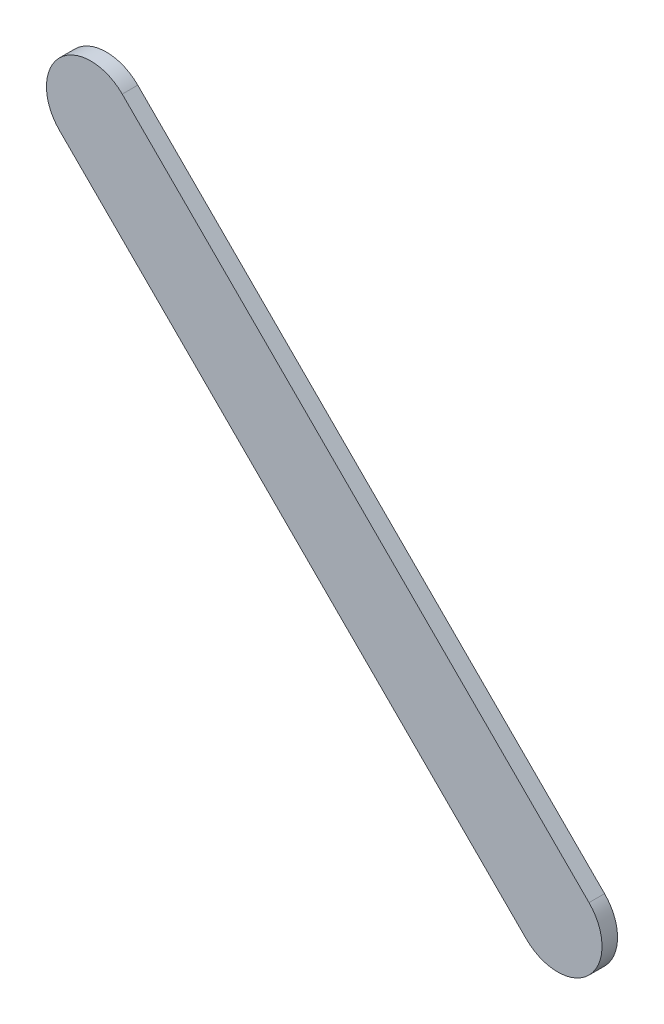
ISO-10303-21;
HEADER;
FILE_DESCRIPTION(('STEP AP214'),'2;1');
FILE_NAME('part.step','',(''),(''),'','','');
FILE_SCHEMA(('AUTOMOTIVE_DESIGN { 1 0 10303 214 1 1 1 1 }'));
ENDSEC;
DATA;
#1=APPLICATION_CONTEXT('core data for automotive mechanical design processes');
#2=APPLICATION_PROTOCOL_DEFINITION('international standard','automotive_design',2000,#1);
#3=PRODUCT_CONTEXT('',#1,'mechanical');
#4=PRODUCT('Part','Part','',(#3));
#5=PRODUCT_RELATED_PRODUCT_CATEGORY('part','',(#4));
#6=PRODUCT_DEFINITION_FORMATION('','',#4);
#7=PRODUCT_DEFINITION_CONTEXT('part definition',#1,'design');
#8=PRODUCT_DEFINITION('design','',#6,#7);
#9=PRODUCT_DEFINITION_SHAPE('','',#8);
#10=(LENGTH_UNIT() NAMED_UNIT(*) SI_UNIT(.MILLI.,.METRE.));
#11=(NAMED_UNIT(*) PLANE_ANGLE_UNIT() SI_UNIT($,.RADIAN.));
#12=(NAMED_UNIT(*) SI_UNIT($,.STERADIAN.) SOLID_ANGLE_UNIT());
#13=UNCERTAINTY_MEASURE_WITH_UNIT(LENGTH_MEASURE(1.E-05),#10,'distance_accuracy_value','');
#14=(GEOMETRIC_REPRESENTATION_CONTEXT(3) GLOBAL_UNCERTAINTY_ASSIGNED_CONTEXT((#13)) GLOBAL_UNIT_ASSIGNED_CONTEXT((#10,
#11,#12)) REPRESENTATION_CONTEXT('',''));
#15=CARTESIAN_POINT('',(0.,0.,0.));
#16=DIRECTION('',(0.,0.,1.));
#17=DIRECTION('',(1.,0.,0.));
#18=AXIS2_PLACEMENT_3D('',#15,#16,#17);
#19=CARTESIAN_POINT('',(90.029289,-123.202943,1.635));
#20=DIRECTION('',(0.,0.,1.));
#21=DIRECTION('',(1.,0.,0.));
#22=AXIS2_PLACEMENT_3D('',#19,#20,#21);
#23=PLANE('',#22);
#24=DIRECTION('',(0.707106781186548,-0.707106781186548,0.));
#25=VECTOR('',#24,1.);
#26=CARTESIAN_POINT('',(90.029289,-123.202943,1.635));
#27=LINE('',#26,#25);
#28=CARTESIAN_POINT('',(90.029289,-123.202943,1.635));
#29=VERTEX_POINT('',#28);
#30=CARTESIAN_POINT('',(91.080761,-124.254415,1.635));
#31=VERTEX_POINT('',#30);
#32=EDGE_CURVE('E84',#29,#31,#27,.T.);
#33=ORIENTED_EDGE('',*,*,#32,.T.);
#34=CARTESIAN_POINT('',(91.1514715,-124.1837045,1.635));
#35=DIRECTION('',(0.,0.,1.));
#36=DIRECTION('',(-0.707106781187048,-0.707106781186048,0.));
#37=AXIS2_PLACEMENT_3D('',#34,#35,#36);
#38=CIRCLE('',#37,0.09999974810218);
#39=CARTESIAN_POINT('',(91.222182,-124.112994,1.635));
#40=VERTEX_POINT('',#39);
#41=EDGE_CURVE('E110',#31,#40,#38,.T.);
#42=ORIENTED_EDGE('',*,*,#41,.T.);
#43=DIRECTION('',(-0.707106781186548,0.707106781186548,0.));
#44=VECTOR('',#43,1.);
#45=CARTESIAN_POINT('',(91.222182,-124.112994,1.635));
#46=LINE('',#45,#44);
#47=CARTESIAN_POINT('',(90.17071,-123.061522,1.635));
#48=VERTEX_POINT('',#47);
#49=EDGE_CURVE('E21',#40,#48,#46,.T.);
#50=ORIENTED_EDGE('',*,*,#49,.T.);
#51=CARTESIAN_POINT('',(90.0999995,-123.1322325,1.635));
#52=DIRECTION('',(0.,0.,1.));
#53=DIRECTION('',(0.707106781186548,0.707106781186548,0.));
#54=AXIS2_PLACEMENT_3D('',#51,#52,#53);
#55=CIRCLE('',#54,0.09999974810218);
#56=EDGE_CURVE('E11',#48,#29,#55,.T.);
#57=ORIENTED_EDGE('',*,*,#56,.T.);
#58=EDGE_LOOP('',(#33,#42,#50,#57));
#59=FACE_BOUND('',#58,.T.);
#60=ADVANCED_FACE('F17',(#59),#23,.T.);
#61=CARTESIAN_POINT('',(90.029289,-123.202943,1.6));
#62=DIRECTION('',(0.,0.,1.));
#63=DIRECTION('',(1.,0.,0.));
#64=AXIS2_PLACEMENT_3D('',#61,#62,#63);
#65=PLANE('',#64);
#66=CARTESIAN_POINT('',(90.0999995,-123.1322325,1.6));
#67=DIRECTION('',(0.,0.,1.));
#68=DIRECTION('',(0.707106781186548,0.707106781186548,0.));
#69=AXIS2_PLACEMENT_3D('',#66,#67,#68);
#70=CIRCLE('',#69,0.09999974810218);
#71=CARTESIAN_POINT('',(90.17071,-123.061522,1.6));
#72=VERTEX_POINT('',#71);
#73=CARTESIAN_POINT('',(90.029289,-123.202943,1.6));
#74=VERTEX_POINT('',#73);
#75=EDGE_CURVE('E27',#72,#74,#70,.T.);
#76=ORIENTED_EDGE('',*,*,#75,.F.);
#77=DIRECTION('',(-0.707106781186548,0.707106781186548,0.));
#78=VECTOR('',#77,1.);
#79=CARTESIAN_POINT('',(91.222182,-124.112994,1.6));
#80=LINE('',#79,#78);
#81=CARTESIAN_POINT('',(91.222182,-124.112994,1.6));
#82=VERTEX_POINT('',#81);
#83=EDGE_CURVE('E102',#82,#72,#80,.T.);
#84=ORIENTED_EDGE('',*,*,#83,.F.);
#85=CARTESIAN_POINT('',(91.1514715,-124.1837045,1.6));
#86=DIRECTION('',(0.,0.,1.));
#87=DIRECTION('',(-0.707106781187048,-0.707106781186048,0.));
#88=AXIS2_PLACEMENT_3D('',#85,#86,#87);
#89=CIRCLE('',#88,0.09999974810218);
#90=CARTESIAN_POINT('',(91.080761,-124.254415,1.6));
#91=VERTEX_POINT('',#90);
#92=EDGE_CURVE('E86',#91,#82,#89,.T.);
#93=ORIENTED_EDGE('',*,*,#92,.F.);
#94=DIRECTION('',(0.707106781186548,-0.707106781186548,0.));
#95=VECTOR('',#94,1.);
#96=CARTESIAN_POINT('',(90.029289,-123.202943,1.6));
#97=LINE('',#96,#95);
#98=EDGE_CURVE('E82',#74,#91,#97,.T.);
#99=ORIENTED_EDGE('',*,*,#98,.F.);
#100=EDGE_LOOP('',(#76,#84,#93,#99));
#101=FACE_BOUND('',#100,.T.);
#102=ADVANCED_FACE('F19',(#101),#65,.F.);
#103=CARTESIAN_POINT('',(90.0999995,-123.1322325,1.6));
#104=DIRECTION('',(0.,0.,-1.));
#105=DIRECTION('',(0.707106781186548,0.707106781186548,0.));
#106=AXIS2_PLACEMENT_3D('',#103,#104,#105);
#107=CYLINDRICAL_SURFACE('',#106,0.09999974810218);
#108=ORIENTED_EDGE('',*,*,#75,.T.);
#109=DIRECTION('',(0.,0.,1.));
#110=VECTOR('',#109,1.);
#111=CARTESIAN_POINT('',(90.029289,-123.202943,1.6));
#112=LINE('',#111,#110);
#113=EDGE_CURVE('E71',#74,#29,#112,.T.);
#114=ORIENTED_EDGE('',*,*,#113,.T.);
#115=ORIENTED_EDGE('',*,*,#56,.F.);
#116=DIRECTION('',(0.,0.,1.));
#117=VECTOR('',#116,1.);
#118=CARTESIAN_POINT('',(90.17071,-123.061522,1.6));
#119=LINE('',#118,#117);
#120=EDGE_CURVE('E74',#72,#48,#119,.T.);
#121=ORIENTED_EDGE('',*,*,#120,.F.);
#122=EDGE_LOOP('',(#108,#114,#115,#121));
#123=FACE_BOUND('',#122,.T.);
#124=ADVANCED_FACE('F70',(#123),#107,.T.);
#125=CARTESIAN_POINT('',(91.222182,-124.112994,1.6));
#126=DIRECTION('',(-0.707106781186548,-0.707106781186548,0.));
#127=DIRECTION('',(-0.707106781186548,0.707106781186548,0.));
#128=AXIS2_PLACEMENT_3D('',#125,#126,#127);
#129=PLANE('',#128);
#130=ORIENTED_EDGE('',*,*,#83,.T.);
#131=ORIENTED_EDGE('',*,*,#120,.T.);
#132=ORIENTED_EDGE('',*,*,#49,.F.);
#133=DIRECTION('',(0.,0.,1.));
#134=VECTOR('',#133,1.);
#135=CARTESIAN_POINT('',(91.222182,-124.112994,1.6));
#136=LINE('',#135,#134);
#137=EDGE_CURVE('E105',#82,#40,#136,.T.);
#138=ORIENTED_EDGE('',*,*,#137,.F.);
#139=EDGE_LOOP('',(#130,#131,#132,#138));
#140=FACE_BOUND('',#139,.T.);
#141=ADVANCED_FACE('F118',(#140),#129,.F.);
#142=CARTESIAN_POINT('',(91.1514715,-124.1837045,1.6));
#143=DIRECTION('',(0.,0.,-1.));
#144=DIRECTION('',(-0.707106781187048,-0.707106781186048,0.));
#145=AXIS2_PLACEMENT_3D('',#142,#143,#144);
#146=CYLINDRICAL_SURFACE('',#145,0.09999974810218);
#147=ORIENTED_EDGE('',*,*,#92,.T.);
#148=ORIENTED_EDGE('',*,*,#137,.T.);
#149=ORIENTED_EDGE('',*,*,#41,.F.);
#150=DIRECTION('',(0.,0.,1.));
#151=VECTOR('',#150,1.);
#152=CARTESIAN_POINT('',(91.080761,-124.254415,1.6));
#153=LINE('',#152,#151);
#154=EDGE_CURVE('E91',#91,#31,#153,.T.);
#155=ORIENTED_EDGE('',*,*,#154,.F.);
#156=EDGE_LOOP('',(#147,#148,#149,#155));
#157=FACE_BOUND('',#156,.T.);
#158=ADVANCED_FACE('F120',(#157),#146,.T.);
#159=CARTESIAN_POINT('',(90.029289,-123.202943,1.6));
#160=DIRECTION('',(0.707106781186548,0.707106781186548,0.));
#161=DIRECTION('',(0.,0.,-1.));
#162=AXIS2_PLACEMENT_3D('',#159,#160,#161);
#163=PLANE('',#162);
#164=ORIENTED_EDGE('',*,*,#98,.T.);
#165=ORIENTED_EDGE('',*,*,#154,.T.);
#166=ORIENTED_EDGE('',*,*,#32,.F.);
#167=ORIENTED_EDGE('',*,*,#113,.F.);
#168=EDGE_LOOP('',(#164,#165,#166,#167));
#169=FACE_BOUND('',#168,.T.);
#170=ADVANCED_FACE('F80',(#169),#163,.F.);
#171=CLOSED_SHELL('',(#60,#102,#124,#141,#158,#170));
#172=MANIFOLD_SOLID_BREP('B1',#171);
#173=ADVANCED_BREP_SHAPE_REPRESENTATION('',(#18,#172),#14);
#174=SHAPE_DEFINITION_REPRESENTATION(#9,#173);
ENDSEC;
END-ISO-10303-21;
